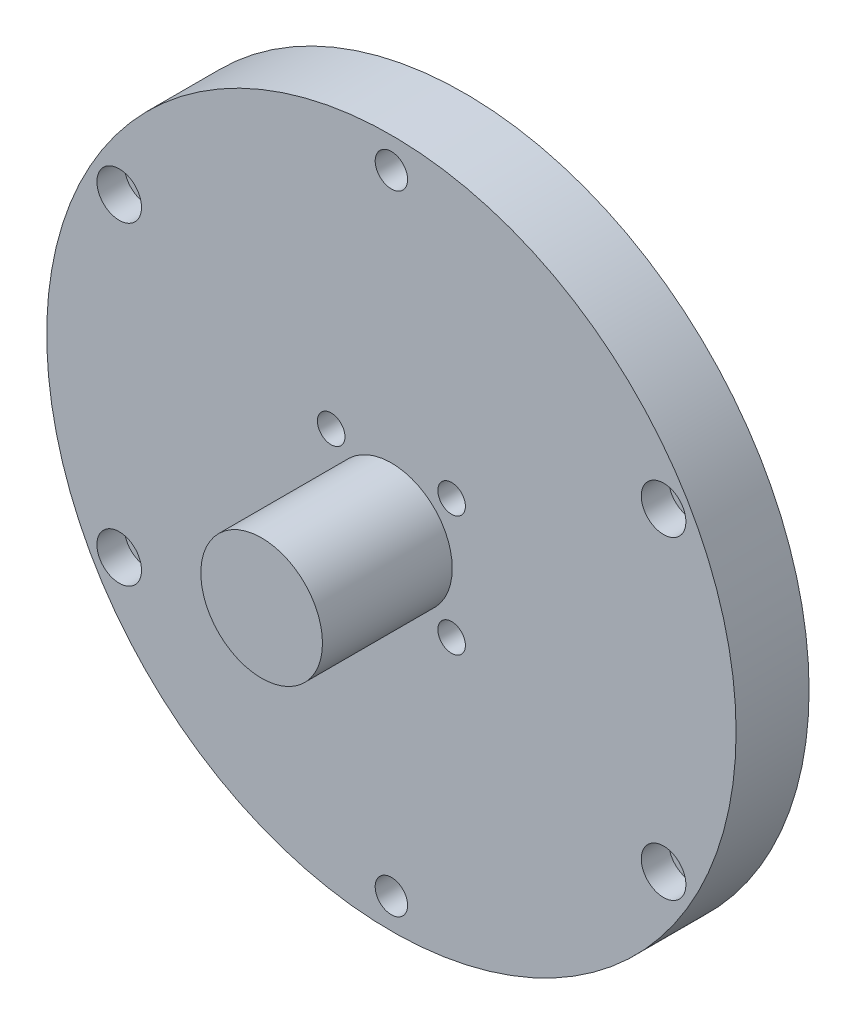
ISO-10303-21;
HEADER;
FILE_DESCRIPTION(('STEP AP214'),'2;1');
FILE_NAME('part.step','',(''),(''),'','','');
FILE_SCHEMA(('AUTOMOTIVE_DESIGN { 1 0 10303 214 1 1 1 1 }'));
ENDSEC;
DATA;
#1=APPLICATION_CONTEXT('core data for automotive mechanical design processes');
#2=APPLICATION_PROTOCOL_DEFINITION('international standard','automotive_design',2000,#1);
#3=PRODUCT_CONTEXT('',#1,'mechanical');
#4=PRODUCT('Part','Part','',(#3));
#5=PRODUCT_RELATED_PRODUCT_CATEGORY('part','',(#4));
#6=PRODUCT_DEFINITION_FORMATION('','',#4);
#7=PRODUCT_DEFINITION_CONTEXT('part definition',#1,'design');
#8=PRODUCT_DEFINITION('design','',#6,#7);
#9=PRODUCT_DEFINITION_SHAPE('','',#8);
#10=(LENGTH_UNIT() NAMED_UNIT(*) SI_UNIT(.MILLI.,.METRE.));
#11=(NAMED_UNIT(*) PLANE_ANGLE_UNIT() SI_UNIT($,.RADIAN.));
#12=(NAMED_UNIT(*) SI_UNIT($,.STERADIAN.) SOLID_ANGLE_UNIT());
#13=UNCERTAINTY_MEASURE_WITH_UNIT(LENGTH_MEASURE(1.E-05),#10,'distance_accuracy_value','');
#14=(GEOMETRIC_REPRESENTATION_CONTEXT(3) GLOBAL_UNCERTAINTY_ASSIGNED_CONTEXT((#13)) GLOBAL_UNIT_ASSIGNED_CONTEXT((#10,
#11,#12)) REPRESENTATION_CONTEXT('',''));
#15=CARTESIAN_POINT('',(0.,0.,0.));
#16=DIRECTION('',(0.,0.,1.));
#17=DIRECTION('',(1.,0.,0.));
#18=AXIS2_PLACEMENT_3D('',#15,#16,#17);
#19=CARTESIAN_POINT('',(0.,0.,18.));
#20=DIRECTION('',(0.,0.,1.));
#21=DIRECTION('',(1.,0.,0.));
#22=AXIS2_PLACEMENT_3D('',#19,#20,#21);
#23=PLANE('',#22);
#24=CARTESIAN_POINT('',(0.,0.,18.));
#25=DIRECTION('',(0.,0.,1.));
#26=DIRECTION('',(1.,0.,0.));
#27=AXIS2_PLACEMENT_3D('',#24,#25,#26);
#28=CIRCLE('',#27,15.);
#29=CARTESIAN_POINT('',(15.,0.,18.));
#30=VERTEX_POINT('',#29);
#31=EDGE_CURVE('E134',#30,#30,#28,.T.);
#32=ORIENTED_EDGE('',*,*,#31,.F.);
#33=EDGE_LOOP('',(#32));
#34=FACE_BOUND('',#33,.T.);
#35=CARTESIAN_POINT('',(-14.8492424049174,14.8492424049176,18.));
#36=DIRECTION('',(0.,0.,1.));
#37=DIRECTION('',(1.,0.,0.));
#38=AXIS2_PLACEMENT_3D('',#35,#36,#37);
#39=CIRCLE('',#38,3.4);
#40=CARTESIAN_POINT('',(-11.4492424049174,14.8492424049176,18.));
#41=VERTEX_POINT('',#40);
#42=EDGE_CURVE('E138',#41,#41,#39,.T.);
#43=ORIENTED_EDGE('',*,*,#42,.F.);
#44=EDGE_LOOP('',(#43));
#45=FACE_BOUND('',#44,.T.);
#46=CARTESIAN_POINT('',(14.8492424049176,14.8492424049174,18.));
#47=DIRECTION('',(0.,0.,1.));
#48=DIRECTION('',(1.,0.,0.));
#49=AXIS2_PLACEMENT_3D('',#46,#47,#48);
#50=CIRCLE('',#49,3.4);
#51=CARTESIAN_POINT('',(18.2492424049176,14.8492424049174,18.));
#52=VERTEX_POINT('',#51);
#53=EDGE_CURVE('E142',#52,#52,#50,.T.);
#54=ORIENTED_EDGE('',*,*,#53,.F.);
#55=EDGE_LOOP('',(#54));
#56=FACE_BOUND('',#55,.T.);
#57=CARTESIAN_POINT('',(14.8492424049173,-14.8492424049177,18.));
#58=DIRECTION('',(0.,0.,1.));
#59=DIRECTION('',(1.,0.,0.));
#60=AXIS2_PLACEMENT_3D('',#57,#58,#59);
#61=CIRCLE('',#60,3.4);
#62=CARTESIAN_POINT('',(18.2492424049173,-14.8492424049177,18.));
#63=VERTEX_POINT('',#62);
#64=EDGE_CURVE('E146',#63,#63,#61,.T.);
#65=ORIENTED_EDGE('',*,*,#64,.F.);
#66=EDGE_LOOP('',(#65));
#67=FACE_BOUND('',#66,.T.);
#68=CARTESIAN_POINT('',(-14.8492424049177,-14.8492424049173,18.));
#69=DIRECTION('',(0.,0.,1.));
#70=DIRECTION('',(1.,0.,0.));
#71=AXIS2_PLACEMENT_3D('',#68,#69,#70);
#72=CIRCLE('',#71,3.4);
#73=CARTESIAN_POINT('',(-11.4492424049177,-14.8492424049173,18.));
#74=VERTEX_POINT('',#73);
#75=EDGE_CURVE('E150',#74,#74,#72,.T.);
#76=ORIENTED_EDGE('',*,*,#75,.F.);
#77=EDGE_LOOP('',(#76));
#78=FACE_BOUND('',#77,.T.);
#79=CARTESIAN_POINT('',(-67.116968793294,38.75,18.));
#80=DIRECTION('',(0.,0.,1.));
#81=DIRECTION('',(1.,0.,0.));
#82=AXIS2_PLACEMENT_3D('',#79,#80,#81);
#83=CIRCLE('',#82,5.50000000000001);
#84=CARTESIAN_POINT('',(-61.616968793294,38.75,18.));
#85=VERTEX_POINT('',#84);
#86=EDGE_CURVE('E154',#85,#85,#83,.T.);
#87=ORIENTED_EDGE('',*,*,#86,.F.);
#88=EDGE_LOOP('',(#87));
#89=FACE_BOUND('',#88,.T.);
#90=CARTESIAN_POINT('',(67.116968793294,38.75,18.));
#91=DIRECTION('',(0.,0.,1.));
#92=DIRECTION('',(1.,0.,0.));
#93=AXIS2_PLACEMENT_3D('',#90,#91,#92);
#94=CIRCLE('',#93,5.50000000000001);
#95=CARTESIAN_POINT('',(72.616968793294,38.75,18.));
#96=VERTEX_POINT('',#95);
#97=EDGE_CURVE('E73',#96,#96,#94,.T.);
#98=ORIENTED_EDGE('',*,*,#97,.F.);
#99=EDGE_LOOP('',(#98));
#100=FACE_BOUND('',#99,.T.);
#101=CARTESIAN_POINT('',(67.116968793294,-38.75,18.));
#102=DIRECTION('',(0.,0.,1.));
#103=DIRECTION('',(1.,0.,0.));
#104=AXIS2_PLACEMENT_3D('',#101,#102,#103);
#105=CIRCLE('',#104,5.50000000000001);
#106=CARTESIAN_POINT('',(72.616968793294,-38.75,18.));
#107=VERTEX_POINT('',#106);
#108=EDGE_CURVE('E66',#107,#107,#105,.T.);
#109=ORIENTED_EDGE('',*,*,#108,.F.);
#110=EDGE_LOOP('',(#109));
#111=FACE_BOUND('',#110,.T.);
#112=CARTESIAN_POINT('',(-67.116968793294,-38.75,18.));
#113=DIRECTION('',(0.,0.,1.));
#114=DIRECTION('',(1.,0.,0.));
#115=AXIS2_PLACEMENT_3D('',#112,#113,#114);
#116=CIRCLE('',#115,5.50000000000001);
#117=CARTESIAN_POINT('',(-61.616968793294,-38.75,18.));
#118=VERTEX_POINT('',#117);
#119=EDGE_CURVE('E62',#118,#118,#116,.T.);
#120=ORIENTED_EDGE('',*,*,#119,.F.);
#121=EDGE_LOOP('',(#120));
#122=FACE_BOUND('',#121,.T.);
#123=CARTESIAN_POINT('',(0.,-77.5,18.));
#124=DIRECTION('',(0.,0.,1.));
#125=DIRECTION('',(1.,0.,0.));
#126=AXIS2_PLACEMENT_3D('',#123,#124,#125);
#127=CIRCLE('',#126,4.);
#128=CARTESIAN_POINT('',(4.00000000000001,-77.5,18.));
#129=VERTEX_POINT('',#128);
#130=EDGE_CURVE('E93',#129,#129,#127,.T.);
#131=ORIENTED_EDGE('',*,*,#130,.F.);
#132=EDGE_LOOP('',(#131));
#133=FACE_BOUND('',#132,.T.);
#134=CARTESIAN_POINT('',(0.,77.5,18.));
#135=DIRECTION('',(0.,0.,1.));
#136=DIRECTION('',(1.,0.,0.));
#137=AXIS2_PLACEMENT_3D('',#134,#135,#136);
#138=CIRCLE('',#137,4.);
#139=CARTESIAN_POINT('',(4.,77.5,18.));
#140=VERTEX_POINT('',#139);
#141=EDGE_CURVE('E49',#140,#140,#138,.T.);
#142=ORIENTED_EDGE('',*,*,#141,.F.);
#143=EDGE_LOOP('',(#142));
#144=FACE_BOUND('',#143,.T.);
#145=CARTESIAN_POINT('',(0.,0.,18.));
#146=DIRECTION('',(0.,0.,1.));
#147=DIRECTION('',(1.,0.,0.));
#148=AXIS2_PLACEMENT_3D('',#145,#146,#147);
#149=CIRCLE('',#148,85.);
#150=CARTESIAN_POINT('',(85.,0.,18.));
#151=VERTEX_POINT('',#150);
#152=EDGE_CURVE('E10',#151,#151,#149,.T.);
#153=ORIENTED_EDGE('',*,*,#152,.T.);
#154=EDGE_LOOP('',(#153));
#155=FACE_BOUND('',#154,.T.);
#156=ADVANCED_FACE('F36',(#34,#45,#56,#67,#78,#89,#100,#111,#122,#133,#144,#155),#23,.T.);
#157=CARTESIAN_POINT('',(0.,0.,0.));
#158=DIRECTION('',(0.,0.,1.));
#159=DIRECTION('',(1.,0.,0.));
#160=AXIS2_PLACEMENT_3D('',#157,#158,#159);
#161=PLANE('',#160);
#162=CARTESIAN_POINT('',(-14.8492424049174,14.8492424049176,0.));
#163=DIRECTION('',(0.,0.,1.));
#164=DIRECTION('',(1.,0.,0.));
#165=AXIS2_PLACEMENT_3D('',#162,#163,#164);
#166=CIRCLE('',#165,3.4);
#167=CARTESIAN_POINT('',(-11.4492424049174,14.8492424049176,0.));
#168=VERTEX_POINT('',#167);
#169=EDGE_CURVE('E353',#168,#168,#166,.T.);
#170=ORIENTED_EDGE('',*,*,#169,.T.);
#171=EDGE_LOOP('',(#170));
#172=FACE_BOUND('',#171,.T.);
#173=CARTESIAN_POINT('',(14.8492424049176,14.8492424049174,0.));
#174=DIRECTION('',(0.,0.,1.));
#175=DIRECTION('',(1.,0.,0.));
#176=AXIS2_PLACEMENT_3D('',#173,#174,#175);
#177=CIRCLE('',#176,3.4);
#178=CARTESIAN_POINT('',(18.2492424049176,14.8492424049174,0.));
#179=VERTEX_POINT('',#178);
#180=EDGE_CURVE('E360',#179,#179,#177,.T.);
#181=ORIENTED_EDGE('',*,*,#180,.T.);
#182=EDGE_LOOP('',(#181));
#183=FACE_BOUND('',#182,.T.);
#184=CARTESIAN_POINT('',(14.8492424049173,-14.8492424049177,0.));
#185=DIRECTION('',(0.,0.,1.));
#186=DIRECTION('',(1.,0.,0.));
#187=AXIS2_PLACEMENT_3D('',#184,#185,#186);
#188=CIRCLE('',#187,3.4);
#189=CARTESIAN_POINT('',(18.2492424049173,-14.8492424049177,0.));
#190=VERTEX_POINT('',#189);
#191=EDGE_CURVE('E364',#190,#190,#188,.T.);
#192=ORIENTED_EDGE('',*,*,#191,.T.);
#193=EDGE_LOOP('',(#192));
#194=FACE_BOUND('',#193,.T.);
#195=CARTESIAN_POINT('',(-14.8492424049177,-14.8492424049173,0.));
#196=DIRECTION('',(0.,0.,1.));
#197=DIRECTION('',(1.,0.,0.));
#198=AXIS2_PLACEMENT_3D('',#195,#196,#197);
#199=CIRCLE('',#198,3.4);
#200=CARTESIAN_POINT('',(-11.4492424049177,-14.8492424049173,0.));
#201=VERTEX_POINT('',#200);
#202=EDGE_CURVE('E368',#201,#201,#199,.T.);
#203=ORIENTED_EDGE('',*,*,#202,.T.);
#204=EDGE_LOOP('',(#203));
#205=FACE_BOUND('',#204,.T.);
#206=CARTESIAN_POINT('',(0.,0.,0.));
#207=DIRECTION('',(0.,0.,1.));
#208=DIRECTION('',(1.,0.,0.));
#209=AXIS2_PLACEMENT_3D('',#206,#207,#208);
#210=CIRCLE('',#209,85.);
#211=CARTESIAN_POINT('',(85.,0.,0.));
#212=VERTEX_POINT('',#211);
#213=EDGE_CURVE('E44',#212,#212,#210,.T.);
#214=ORIENTED_EDGE('',*,*,#213,.F.);
#215=EDGE_LOOP('',(#214));
#216=FACE_BOUND('',#215,.T.);
#217=CARTESIAN_POINT('',(0.,77.5,0.));
#218=DIRECTION('',(0.,0.,1.));
#219=DIRECTION('',(1.,0.,0.));
#220=AXIS2_PLACEMENT_3D('',#217,#218,#219);
#221=CIRCLE('',#220,4.);
#222=CARTESIAN_POINT('',(4.,77.5,0.));
#223=VERTEX_POINT('',#222);
#224=EDGE_CURVE('E52',#223,#223,#221,.T.);
#225=ORIENTED_EDGE('',*,*,#224,.T.);
#226=EDGE_LOOP('',(#225));
#227=FACE_BOUND('',#226,.T.);
#228=CARTESIAN_POINT('',(67.116968793294,38.75,0.));
#229=DIRECTION('',(0.,0.,1.));
#230=DIRECTION('',(1.,0.,0.));
#231=AXIS2_PLACEMENT_3D('',#228,#229,#230);
#232=CIRCLE('',#231,4.00000000000001);
#233=CARTESIAN_POINT('',(71.116968793294,38.75,0.));
#234=VERTEX_POINT('',#233);
#235=EDGE_CURVE('E101',#234,#234,#232,.T.);
#236=ORIENTED_EDGE('',*,*,#235,.T.);
#237=EDGE_LOOP('',(#236));
#238=FACE_BOUND('',#237,.T.);
#239=CARTESIAN_POINT('',(67.116968793294,-38.75,0.));
#240=DIRECTION('',(0.,0.,1.));
#241=DIRECTION('',(1.,0.,0.));
#242=AXIS2_PLACEMENT_3D('',#239,#240,#241);
#243=CIRCLE('',#242,4.00000000000001);
#244=CARTESIAN_POINT('',(71.116968793294,-38.75,0.));
#245=VERTEX_POINT('',#244);
#246=EDGE_CURVE('E96',#245,#245,#243,.T.);
#247=ORIENTED_EDGE('',*,*,#246,.T.);
#248=EDGE_LOOP('',(#247));
#249=FACE_BOUND('',#248,.T.);
#250=CARTESIAN_POINT('',(0.,-77.5,0.));
#251=DIRECTION('',(0.,0.,1.));
#252=DIRECTION('',(1.,0.,0.));
#253=AXIS2_PLACEMENT_3D('',#250,#251,#252);
#254=CIRCLE('',#253,4.);
#255=CARTESIAN_POINT('',(4.00000000000001,-77.5,0.));
#256=VERTEX_POINT('',#255);
#257=EDGE_CURVE('E92',#256,#256,#254,.T.);
#258=ORIENTED_EDGE('',*,*,#257,.T.);
#259=EDGE_LOOP('',(#258));
#260=FACE_BOUND('',#259,.T.);
#261=CARTESIAN_POINT('',(-67.116968793294,-38.75,0.));
#262=DIRECTION('',(0.,0.,1.));
#263=DIRECTION('',(1.,0.,0.));
#264=AXIS2_PLACEMENT_3D('',#261,#262,#263);
#265=CIRCLE('',#264,4.00000000000001);
#266=CARTESIAN_POINT('',(-63.116968793294,-38.75,0.));
#267=VERTEX_POINT('',#266);
#268=EDGE_CURVE('E89',#267,#267,#265,.T.);
#269=ORIENTED_EDGE('',*,*,#268,.T.);
#270=EDGE_LOOP('',(#269));
#271=FACE_BOUND('',#270,.T.);
#272=CARTESIAN_POINT('',(-67.116968793294,38.75,0.));
#273=DIRECTION('',(0.,0.,1.));
#274=DIRECTION('',(1.,0.,0.));
#275=AXIS2_PLACEMENT_3D('',#272,#273,#274);
#276=CIRCLE('',#275,4.00000000000001);
#277=CARTESIAN_POINT('',(-63.116968793294,38.75,0.));
#278=VERTEX_POINT('',#277);
#279=EDGE_CURVE('E58',#278,#278,#276,.T.);
#280=ORIENTED_EDGE('',*,*,#279,.T.);
#281=EDGE_LOOP('',(#280));
#282=FACE_BOUND('',#281,.T.);
#283=ADVANCED_FACE('F109',(#172,#183,#194,#205,#216,#227,#238,#249,#260,#271,#282),#161,.F.);
#284=CARTESIAN_POINT('',(0.,0.,18.));
#285=DIRECTION('',(0.,0.,-1.));
#286=DIRECTION('',(-1.,0.,0.));
#287=AXIS2_PLACEMENT_3D('',#284,#285,#286);
#288=CYLINDRICAL_SURFACE('',#287,85.);
#289=ORIENTED_EDGE('',*,*,#152,.F.);
#290=EDGE_LOOP('',(#289));
#291=FACE_BOUND('',#290,.T.);
#292=ORIENTED_EDGE('',*,*,#213,.T.);
#293=EDGE_LOOP('',(#292));
#294=FACE_BOUND('',#293,.T.);
#295=ADVANCED_FACE('F38',(#291,#294),#288,.T.);
#296=CARTESIAN_POINT('',(0.,77.5,18.));
#297=DIRECTION('',(0.,0.,-1.));
#298=DIRECTION('',(-1.,0.,0.));
#299=AXIS2_PLACEMENT_3D('',#296,#297,#298);
#300=CYLINDRICAL_SURFACE('',#299,4.);
#301=ORIENTED_EDGE('',*,*,#141,.T.);
#302=EDGE_LOOP('',(#301));
#303=FACE_BOUND('',#302,.T.);
#304=ORIENTED_EDGE('',*,*,#224,.F.);
#305=EDGE_LOOP('',(#304));
#306=FACE_BOUND('',#305,.T.);
#307=ADVANCED_FACE('F112',(#303,#306),#300,.F.);
#308=CARTESIAN_POINT('',(67.116968793294,38.75,18.));
#309=DIRECTION('',(0.,0.,-1.));
#310=DIRECTION('',(-1.,0.,0.));
#311=AXIS2_PLACEMENT_3D('',#308,#309,#310);
#312=CYLINDRICAL_SURFACE('',#311,4.00000000000001);
#313=CARTESIAN_POINT('',(67.116968793294,38.75,11.2));
#314=DIRECTION('',(0.,0.,-1.));
#315=DIRECTION('',(-1.,0.,0.));
#316=AXIS2_PLACEMENT_3D('',#313,#314,#315);
#317=CIRCLE('',#316,4.00000000000001);
#318=CARTESIAN_POINT('',(63.116968793294,38.75,11.2));
#319=VERTEX_POINT('',#318);
#320=EDGE_CURVE('E64',#319,#319,#317,.T.);
#321=ORIENTED_EDGE('',*,*,#320,.F.);
#322=EDGE_LOOP('',(#321));
#323=FACE_BOUND('',#322,.T.);
#324=ORIENTED_EDGE('',*,*,#235,.F.);
#325=EDGE_LOOP('',(#324));
#326=FACE_BOUND('',#325,.T.);
#327=ADVANCED_FACE('F114',(#323,#326),#312,.F.);
#328=CARTESIAN_POINT('',(67.116968793294,-38.75,18.));
#329=DIRECTION('',(0.,0.,-1.));
#330=DIRECTION('',(-1.,0.,0.));
#331=AXIS2_PLACEMENT_3D('',#328,#329,#330);
#332=CYLINDRICAL_SURFACE('',#331,4.00000000000001);
#333=CARTESIAN_POINT('',(67.116968793294,-38.75,11.2));
#334=DIRECTION('',(0.,0.,-1.));
#335=DIRECTION('',(-1.,0.,0.));
#336=AXIS2_PLACEMENT_3D('',#333,#334,#335);
#337=CIRCLE('',#336,4.00000000000001);
#338=CARTESIAN_POINT('',(63.116968793294,-38.75,11.2));
#339=VERTEX_POINT('',#338);
#340=EDGE_CURVE('E60',#339,#339,#337,.T.);
#341=ORIENTED_EDGE('',*,*,#340,.F.);
#342=EDGE_LOOP('',(#341));
#343=FACE_BOUND('',#342,.T.);
#344=ORIENTED_EDGE('',*,*,#246,.F.);
#345=EDGE_LOOP('',(#344));
#346=FACE_BOUND('',#345,.T.);
#347=ADVANCED_FACE('F120',(#343,#346),#332,.F.);
#348=CARTESIAN_POINT('',(0.,-77.5,18.));
#349=DIRECTION('',(0.,0.,-1.));
#350=DIRECTION('',(-1.,0.,0.));
#351=AXIS2_PLACEMENT_3D('',#348,#349,#350);
#352=CYLINDRICAL_SURFACE('',#351,4.);
#353=ORIENTED_EDGE('',*,*,#130,.T.);
#354=EDGE_LOOP('',(#353));
#355=FACE_BOUND('',#354,.T.);
#356=ORIENTED_EDGE('',*,*,#257,.F.);
#357=EDGE_LOOP('',(#356));
#358=FACE_BOUND('',#357,.T.);
#359=ADVANCED_FACE('F164',(#355,#358),#352,.F.);
#360=CARTESIAN_POINT('',(-67.116968793294,-38.75,18.));
#361=DIRECTION('',(0.,0.,-1.));
#362=DIRECTION('',(-1.,0.,0.));
#363=AXIS2_PLACEMENT_3D('',#360,#361,#362);
#364=CYLINDRICAL_SURFACE('',#363,4.00000000000001);
#365=CARTESIAN_POINT('',(-67.116968793294,-38.75,11.2));
#366=DIRECTION('',(0.,0.,-1.));
#367=DIRECTION('',(-1.,0.,0.));
#368=AXIS2_PLACEMENT_3D('',#365,#366,#367);
#369=CIRCLE('',#368,4.00000000000001);
#370=CARTESIAN_POINT('',(-71.116968793294,-38.75,11.2));
#371=VERTEX_POINT('',#370);
#372=EDGE_CURVE('E55',#371,#371,#369,.T.);
#373=ORIENTED_EDGE('',*,*,#372,.F.);
#374=EDGE_LOOP('',(#373));
#375=FACE_BOUND('',#374,.T.);
#376=ORIENTED_EDGE('',*,*,#268,.F.);
#377=EDGE_LOOP('',(#376));
#378=FACE_BOUND('',#377,.T.);
#379=ADVANCED_FACE('F167',(#375,#378),#364,.F.);
#380=CARTESIAN_POINT('',(-67.116968793294,38.75,18.));
#381=DIRECTION('',(0.,0.,-1.));
#382=DIRECTION('',(-1.,0.,0.));
#383=AXIS2_PLACEMENT_3D('',#380,#381,#382);
#384=CYLINDRICAL_SURFACE('',#383,4.00000000000001);
#385=CARTESIAN_POINT('',(-67.116968793294,38.75,11.2));
#386=DIRECTION('',(0.,0.,-1.));
#387=DIRECTION('',(-1.,0.,0.));
#388=AXIS2_PLACEMENT_3D('',#385,#386,#387);
#389=CIRCLE('',#388,4.00000000000001);
#390=CARTESIAN_POINT('',(-71.116968793294,38.75,11.2));
#391=VERTEX_POINT('',#390);
#392=EDGE_CURVE('E40',#391,#391,#389,.T.);
#393=ORIENTED_EDGE('',*,*,#392,.F.);
#394=EDGE_LOOP('',(#393));
#395=FACE_BOUND('',#394,.T.);
#396=ORIENTED_EDGE('',*,*,#279,.F.);
#397=EDGE_LOOP('',(#396));
#398=FACE_BOUND('',#397,.T.);
#399=ADVANCED_FACE('F176',(#395,#398),#384,.F.);
#400=CARTESIAN_POINT('',(-63.816968793294,-38.75,11.2));
#401=DIRECTION('',(0.,0.,-1.));
#402=DIRECTION('',(-1.,0.,0.));
#403=AXIS2_PLACEMENT_3D('',#400,#401,#402);
#404=PLANE('',#403);
#405=ORIENTED_EDGE('',*,*,#372,.T.);
#406=EDGE_LOOP('',(#405));
#407=FACE_BOUND('',#406,.T.);
#408=CARTESIAN_POINT('',(-67.116968793294,-38.75,11.2));
#409=DIRECTION('',(0.,0.,1.));
#410=DIRECTION('',(1.,0.,0.));
#411=AXIS2_PLACEMENT_3D('',#408,#409,#410);
#412=CIRCLE('',#411,5.5);
#413=CARTESIAN_POINT('',(-61.616968793294,-38.75,11.2));
#414=VERTEX_POINT('',#413);
#415=EDGE_CURVE('E59',#414,#414,#412,.T.);
#416=ORIENTED_EDGE('',*,*,#415,.T.);
#417=EDGE_LOOP('',(#416));
#418=FACE_BOUND('',#417,.T.);
#419=ADVANCED_FACE('F178',(#407,#418),#404,.F.);
#420=CARTESIAN_POINT('',(-67.116968793294,-38.75,18.));
#421=DIRECTION('',(0.,0.,1.));
#422=DIRECTION('',(1.,0.,0.));
#423=AXIS2_PLACEMENT_3D('',#420,#421,#422);
#424=CYLINDRICAL_SURFACE('',#423,5.5);
#425=ORIENTED_EDGE('',*,*,#415,.F.);
#426=EDGE_LOOP('',(#425));
#427=FACE_BOUND('',#426,.T.);
#428=ORIENTED_EDGE('',*,*,#119,.T.);
#429=EDGE_LOOP('',(#428));
#430=FACE_BOUND('',#429,.T.);
#431=ADVANCED_FACE('F185',(#427,#430),#424,.F.);
#432=CARTESIAN_POINT('',(70.416968793294,-38.75,11.2));
#433=DIRECTION('',(0.,0.,-1.));
#434=DIRECTION('',(-1.,0.,0.));
#435=AXIS2_PLACEMENT_3D('',#432,#433,#434);
#436=PLANE('',#435);
#437=ORIENTED_EDGE('',*,*,#340,.T.);
#438=EDGE_LOOP('',(#437));
#439=FACE_BOUND('',#438,.T.);
#440=CARTESIAN_POINT('',(67.116968793294,-38.75,11.2));
#441=DIRECTION('',(0.,0.,1.));
#442=DIRECTION('',(1.,0.,0.));
#443=AXIS2_PLACEMENT_3D('',#440,#441,#442);
#444=CIRCLE('',#443,5.49999999999999);
#445=CARTESIAN_POINT('',(72.616968793294,-38.75,11.2));
#446=VERTEX_POINT('',#445);
#447=EDGE_CURVE('E63',#446,#446,#444,.T.);
#448=ORIENTED_EDGE('',*,*,#447,.T.);
#449=EDGE_LOOP('',(#448));
#450=FACE_BOUND('',#449,.T.);
#451=ADVANCED_FACE('F202',(#439,#450),#436,.F.);
#452=CARTESIAN_POINT('',(67.116968793294,-38.75,18.));
#453=DIRECTION('',(0.,0.,1.));
#454=DIRECTION('',(1.,0.,0.));
#455=AXIS2_PLACEMENT_3D('',#452,#453,#454);
#456=CYLINDRICAL_SURFACE('',#455,5.5);
#457=ORIENTED_EDGE('',*,*,#447,.F.);
#458=EDGE_LOOP('',(#457));
#459=FACE_BOUND('',#458,.T.);
#460=ORIENTED_EDGE('',*,*,#108,.T.);
#461=EDGE_LOOP('',(#460));
#462=FACE_BOUND('',#461,.T.);
#463=ADVANCED_FACE('F205',(#459,#462),#456,.F.);
#464=CARTESIAN_POINT('',(70.416968793294,38.75,11.2));
#465=DIRECTION('',(0.,0.,-1.));
#466=DIRECTION('',(-1.,0.,0.));
#467=AXIS2_PLACEMENT_3D('',#464,#465,#466);
#468=PLANE('',#467);
#469=ORIENTED_EDGE('',*,*,#320,.T.);
#470=EDGE_LOOP('',(#469));
#471=FACE_BOUND('',#470,.T.);
#472=CARTESIAN_POINT('',(67.116968793294,38.75,11.2));
#473=DIRECTION('',(0.,0.,1.));
#474=DIRECTION('',(1.,0.,0.));
#475=AXIS2_PLACEMENT_3D('',#472,#473,#474);
#476=CIRCLE('',#475,5.49999999999999);
#477=CARTESIAN_POINT('',(72.616968793294,38.75,11.2));
#478=VERTEX_POINT('',#477);
#479=EDGE_CURVE('E67',#478,#478,#476,.T.);
#480=ORIENTED_EDGE('',*,*,#479,.T.);
#481=EDGE_LOOP('',(#480));
#482=FACE_BOUND('',#481,.T.);
#483=ADVANCED_FACE('F211',(#471,#482),#468,.F.);
#484=CARTESIAN_POINT('',(67.116968793294,38.75,18.));
#485=DIRECTION('',(0.,0.,1.));
#486=DIRECTION('',(1.,0.,0.));
#487=AXIS2_PLACEMENT_3D('',#484,#485,#486);
#488=CYLINDRICAL_SURFACE('',#487,5.5);
#489=ORIENTED_EDGE('',*,*,#479,.F.);
#490=EDGE_LOOP('',(#489));
#491=FACE_BOUND('',#490,.T.);
#492=ORIENTED_EDGE('',*,*,#97,.T.);
#493=EDGE_LOOP('',(#492));
#494=FACE_BOUND('',#493,.T.);
#495=ADVANCED_FACE('F216',(#491,#494),#488,.F.);
#496=CARTESIAN_POINT('',(-63.816968793294,38.75,11.2));
#497=DIRECTION('',(0.,0.,-1.));
#498=DIRECTION('',(-1.,0.,0.));
#499=AXIS2_PLACEMENT_3D('',#496,#497,#498);
#500=PLANE('',#499);
#501=ORIENTED_EDGE('',*,*,#392,.T.);
#502=EDGE_LOOP('',(#501));
#503=FACE_BOUND('',#502,.T.);
#504=CARTESIAN_POINT('',(-67.116968793294,38.75,11.2));
#505=DIRECTION('',(0.,0.,1.));
#506=DIRECTION('',(1.,0.,0.));
#507=AXIS2_PLACEMENT_3D('',#504,#505,#506);
#508=CIRCLE('',#507,5.5);
#509=CARTESIAN_POINT('',(-61.616968793294,38.75,11.2));
#510=VERTEX_POINT('',#509);
#511=EDGE_CURVE('E371',#510,#510,#508,.T.);
#512=ORIENTED_EDGE('',*,*,#511,.T.);
#513=EDGE_LOOP('',(#512));
#514=FACE_BOUND('',#513,.T.);
#515=ADVANCED_FACE('F251',(#503,#514),#500,.F.);
#516=CARTESIAN_POINT('',(-67.116968793294,38.75,18.));
#517=DIRECTION('',(0.,0.,1.));
#518=DIRECTION('',(1.,0.,0.));
#519=AXIS2_PLACEMENT_3D('',#516,#517,#518);
#520=CYLINDRICAL_SURFACE('',#519,5.5);
#521=ORIENTED_EDGE('',*,*,#511,.F.);
#522=EDGE_LOOP('',(#521));
#523=FACE_BOUND('',#522,.T.);
#524=ORIENTED_EDGE('',*,*,#86,.T.);
#525=EDGE_LOOP('',(#524));
#526=FACE_BOUND('',#525,.T.);
#527=ADVANCED_FACE('F260',(#523,#526),#520,.F.);
#528=CARTESIAN_POINT('',(-14.8492424049177,-14.8492424049173,18.));
#529=DIRECTION('',(0.,0.,1.));
#530=DIRECTION('',(1.,0.,0.));
#531=AXIS2_PLACEMENT_3D('',#528,#529,#530);
#532=CYLINDRICAL_SURFACE('',#531,3.4);
#533=ORIENTED_EDGE('',*,*,#202,.F.);
#534=EDGE_LOOP('',(#533));
#535=FACE_BOUND('',#534,.T.);
#536=ORIENTED_EDGE('',*,*,#75,.T.);
#537=EDGE_LOOP('',(#536));
#538=FACE_BOUND('',#537,.T.);
#539=ADVANCED_FACE('F270',(#535,#538),#532,.F.);
#540=CARTESIAN_POINT('',(14.8492424049173,-14.8492424049177,18.));
#541=DIRECTION('',(0.,0.,1.));
#542=DIRECTION('',(1.,0.,0.));
#543=AXIS2_PLACEMENT_3D('',#540,#541,#542);
#544=CYLINDRICAL_SURFACE('',#543,3.4);
#545=ORIENTED_EDGE('',*,*,#191,.F.);
#546=EDGE_LOOP('',(#545));
#547=FACE_BOUND('',#546,.T.);
#548=ORIENTED_EDGE('',*,*,#64,.T.);
#549=EDGE_LOOP('',(#548));
#550=FACE_BOUND('',#549,.T.);
#551=ADVANCED_FACE('F289',(#547,#550),#544,.F.);
#552=CARTESIAN_POINT('',(14.8492424049176,14.8492424049174,18.));
#553=DIRECTION('',(0.,0.,1.));
#554=DIRECTION('',(1.,0.,0.));
#555=AXIS2_PLACEMENT_3D('',#552,#553,#554);
#556=CYLINDRICAL_SURFACE('',#555,3.4);
#557=ORIENTED_EDGE('',*,*,#180,.F.);
#558=EDGE_LOOP('',(#557));
#559=FACE_BOUND('',#558,.T.);
#560=ORIENTED_EDGE('',*,*,#53,.T.);
#561=EDGE_LOOP('',(#560));
#562=FACE_BOUND('',#561,.T.);
#563=ADVANCED_FACE('F300',(#559,#562),#556,.F.);
#564=CARTESIAN_POINT('',(-14.8492424049174,14.8492424049176,18.));
#565=DIRECTION('',(0.,0.,1.));
#566=DIRECTION('',(1.,0.,0.));
#567=AXIS2_PLACEMENT_3D('',#564,#565,#566);
#568=CYLINDRICAL_SURFACE('',#567,3.4);
#569=ORIENTED_EDGE('',*,*,#169,.F.);
#570=EDGE_LOOP('',(#569));
#571=FACE_BOUND('',#570,.T.);
#572=ORIENTED_EDGE('',*,*,#42,.T.);
#573=EDGE_LOOP('',(#572));
#574=FACE_BOUND('',#573,.T.);
#575=ADVANCED_FACE('F311',(#571,#574),#568,.F.);
#576=CARTESIAN_POINT('',(0.,0.,50.));
#577=DIRECTION('',(0.,0.,-1.));
#578=DIRECTION('',(-1.,0.,0.));
#579=AXIS2_PLACEMENT_3D('',#576,#577,#578);
#580=CYLINDRICAL_SURFACE('',#579,15.);
#581=CARTESIAN_POINT('',(0.,0.,50.));
#582=DIRECTION('',(0.,0.,1.));
#583=DIRECTION('',(1.,0.,0.));
#584=AXIS2_PLACEMENT_3D('',#581,#582,#583);
#585=CIRCLE('',#584,15.);
#586=CARTESIAN_POINT('',(15.,0.,50.));
#587=VERTEX_POINT('',#586);
#588=EDGE_CURVE('E351',#587,#587,#585,.T.);
#589=ORIENTED_EDGE('',*,*,#588,.F.);
#590=EDGE_LOOP('',(#589));
#591=FACE_BOUND('',#590,.T.);
#592=ORIENTED_EDGE('',*,*,#31,.T.);
#593=EDGE_LOOP('',(#592));
#594=FACE_BOUND('',#593,.T.);
#595=ADVANCED_FACE('F321',(#591,#594),#580,.T.);
#596=CARTESIAN_POINT('',(0.,0.,50.));
#597=DIRECTION('',(0.,0.,1.));
#598=DIRECTION('',(1.,0.,0.));
#599=AXIS2_PLACEMENT_3D('',#596,#597,#598);
#600=PLANE('',#599);
#601=ORIENTED_EDGE('',*,*,#588,.T.);
#602=EDGE_LOOP('',(#601));
#603=FACE_BOUND('',#602,.T.);
#604=ADVANCED_FACE('F335',(#603),#600,.T.);
#605=CLOSED_SHELL('',(#156,#283,#295,#307,#327,#347,#359,#379,#399,#419,#431,#451,#463,#483,
#495,#515,#527,#539,#551,#563,#575,#595,#604));
#606=MANIFOLD_SOLID_BREP('B2',#605);
#607=ADVANCED_BREP_SHAPE_REPRESENTATION('',(#18,#606),#14);
#608=SHAPE_DEFINITION_REPRESENTATION(#9,#607);
ENDSEC;
END-ISO-10303-21;
